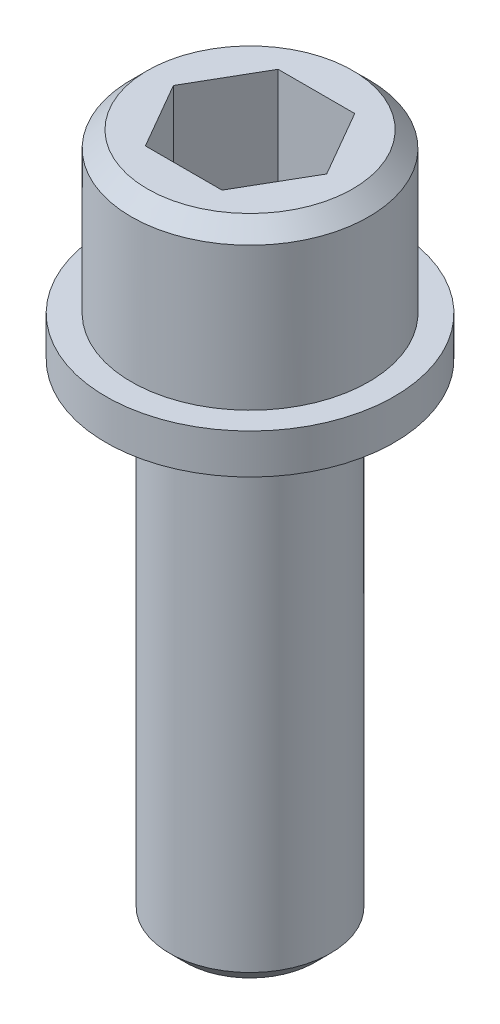
ISO-10303-21;
HEADER;
FILE_DESCRIPTION(('STEP AP214'),'2;1');
FILE_NAME('part.step','',(''),(''),'','','');
FILE_SCHEMA(('AUTOMOTIVE_DESIGN { 1 0 10303 214 1 1 1 1 }'));
ENDSEC;
DATA;
#1=APPLICATION_CONTEXT('core data for automotive mechanical design processes');
#2=APPLICATION_PROTOCOL_DEFINITION('international standard','automotive_design',2000,#1);
#3=PRODUCT_CONTEXT('',#1,'mechanical');
#4=PRODUCT('Part','Part','',(#3));
#5=PRODUCT_RELATED_PRODUCT_CATEGORY('part','',(#4));
#6=PRODUCT_DEFINITION_FORMATION('','',#4);
#7=PRODUCT_DEFINITION_CONTEXT('part definition',#1,'design');
#8=PRODUCT_DEFINITION('design','',#6,#7);
#9=PRODUCT_DEFINITION_SHAPE('','',#8);
#10=(LENGTH_UNIT() NAMED_UNIT(*) SI_UNIT(.MILLI.,.METRE.));
#11=(NAMED_UNIT(*) PLANE_ANGLE_UNIT() SI_UNIT($,.RADIAN.));
#12=(NAMED_UNIT(*) SI_UNIT($,.STERADIAN.) SOLID_ANGLE_UNIT());
#13=UNCERTAINTY_MEASURE_WITH_UNIT(LENGTH_MEASURE(1.E-05),#10,'distance_accuracy_value','');
#14=(GEOMETRIC_REPRESENTATION_CONTEXT(3) GLOBAL_UNCERTAINTY_ASSIGNED_CONTEXT((#13)) GLOBAL_UNIT_ASSIGNED_CONTEXT((#10,
#11,#12)) REPRESENTATION_CONTEXT('',''));
#15=CARTESIAN_POINT('',(0.,0.,0.));
#16=DIRECTION('',(0.,0.,1.));
#17=DIRECTION('',(1.,0.,0.));
#18=AXIS2_PLACEMENT_3D('',#15,#16,#17);
#19=CARTESIAN_POINT('',(0.,41.275,0.));
#20=DIRECTION('',(0.,1.,0.));
#21=DIRECTION('',(0.,0.,1.));
#22=AXIS2_PLACEMENT_3D('',#19,#20,#21);
#23=PLANE('',#22);
#24=CARTESIAN_POINT('',(0.,41.275,0.));
#25=DIRECTION('',(0.,1.,0.));
#26=DIRECTION('',(0.,0.,1.));
#27=AXIS2_PLACEMENT_3D('',#24,#25,#26);
#28=CIRCLE('',#27,6.1468);
#29=CARTESIAN_POINT('',(0.,41.275,6.1468));
#30=VERTEX_POINT('',#29);
#31=EDGE_CURVE('E11',#30,#30,#28,.T.);
#32=ORIENTED_EDGE('',*,*,#31,.T.);
#33=EDGE_LOOP('',(#32));
#34=FACE_BOUND('',#33,.T.);
#35=DIRECTION('',(-1.,0.,0.));
#36=VECTOR('',#35,1.);
#37=CARTESIAN_POINT('',(2.29502505505568,41.275,-3.9751));
#38=LINE('',#37,#36);
#39=CARTESIAN_POINT('',(2.29502505505568,41.275,-3.9751));
#40=VERTEX_POINT('',#39);
#41=CARTESIAN_POINT('',(-2.29502505505568,41.275,-3.9751));
#42=VERTEX_POINT('',#41);
#43=EDGE_CURVE('E49',#40,#42,#38,.T.);
#44=ORIENTED_EDGE('',*,*,#43,.F.);
#45=DIRECTION('',(-0.5,0.,-0.866025403784439));
#46=VECTOR('',#45,1.);
#47=CARTESIAN_POINT('',(4.59005011011136,41.275,0.));
#48=LINE('',#47,#46);
#49=CARTESIAN_POINT('',(4.59005011011136,41.275,0.));
#50=VERTEX_POINT('',#49);
#51=EDGE_CURVE('E132',#50,#40,#48,.T.);
#52=ORIENTED_EDGE('',*,*,#51,.F.);
#53=DIRECTION('',(0.5,0.,-0.866025403784439));
#54=VECTOR('',#53,1.);
#55=CARTESIAN_POINT('',(2.29502505505568,41.275,3.9751));
#56=LINE('',#55,#54);
#57=CARTESIAN_POINT('',(2.29502505505568,41.275,3.9751));
#58=VERTEX_POINT('',#57);
#59=EDGE_CURVE('E130',#58,#50,#56,.T.);
#60=ORIENTED_EDGE('',*,*,#59,.F.);
#61=DIRECTION('',(1.,0.,0.));
#62=VECTOR('',#61,1.);
#63=CARTESIAN_POINT('',(-2.29502505505568,41.275,3.9751));
#64=LINE('',#63,#62);
#65=CARTESIAN_POINT('',(-2.29502505505568,41.275,3.9751));
#66=VERTEX_POINT('',#65);
#67=EDGE_CURVE('E97',#66,#58,#64,.T.);
#68=ORIENTED_EDGE('',*,*,#67,.F.);
#69=DIRECTION('',(0.5,0.,0.866025403784438));
#70=VECTOR('',#69,1.);
#71=CARTESIAN_POINT('',(-4.59005011011136,41.275,0.));
#72=LINE('',#71,#70);
#73=CARTESIAN_POINT('',(-4.59005011011136,41.275,0.));
#74=VERTEX_POINT('',#73);
#75=EDGE_CURVE('E126',#74,#66,#72,.T.);
#76=ORIENTED_EDGE('',*,*,#75,.F.);
#77=DIRECTION('',(-0.5,0.,0.866025403784439));
#78=VECTOR('',#77,1.);
#79=CARTESIAN_POINT('',(-2.29502505505568,41.275,-3.9751));
#80=LINE('',#79,#78);
#81=EDGE_CURVE('E123',#42,#74,#80,.T.);
#82=ORIENTED_EDGE('',*,*,#81,.F.);
#83=EDGE_LOOP('',(#44,#52,#60,#68,#76,#82));
#84=FACE_BOUND('',#83,.T.);
#85=ADVANCED_FACE('F34',(#34,#84),#23,.T.);
#86=CARTESIAN_POINT('',(0.,0.,0.));
#87=DIRECTION('',(0.,-1.,0.));
#88=DIRECTION('',(0.,0.,-1.));
#89=AXIS2_PLACEMENT_3D('',#86,#87,#88);
#90=CYLINDRICAL_SURFACE('',#89,7.112);
#91=CARTESIAN_POINT('',(0.,40.3098,0.));
#92=DIRECTION('',(0.,1.,0.));
#93=DIRECTION('',(0.,0.,1.));
#94=AXIS2_PLACEMENT_3D('',#91,#92,#93);
#95=CIRCLE('',#94,7.112);
#96=CARTESIAN_POINT('',(0.,40.3098,7.112));
#97=VERTEX_POINT('',#96);
#98=EDGE_CURVE('E42',#97,#97,#95,.F.);
#99=ORIENTED_EDGE('',*,*,#98,.T.);
#100=EDGE_LOOP('',(#99));
#101=FACE_BOUND('',#100,.T.);
#102=CARTESIAN_POINT('',(0.,31.75,0.));
#103=DIRECTION('',(0.,-1.,0.));
#104=DIRECTION('',(0.,0.,-1.));
#105=AXIS2_PLACEMENT_3D('',#102,#103,#104);
#106=CIRCLE('',#105,7.112);
#107=CARTESIAN_POINT('',(0.,31.75,-7.112));
#108=VERTEX_POINT('',#107);
#109=EDGE_CURVE('E150',#108,#108,#106,.T.);
#110=ORIENTED_EDGE('',*,*,#109,.F.);
#111=EDGE_LOOP('',(#110));
#112=FACE_BOUND('',#111,.T.);
#113=ADVANCED_FACE('F161',(#101,#112),#90,.T.);
#114=CARTESIAN_POINT('',(7.112,31.75,0.));
#115=DIRECTION('',(0.,1.,0.));
#116=DIRECTION('',(0.,0.,1.));
#117=AXIS2_PLACEMENT_3D('',#114,#115,#116);
#118=PLANE('',#117);
#119=ORIENTED_EDGE('',*,*,#109,.T.);
#120=EDGE_LOOP('',(#119));
#121=FACE_BOUND('',#120,.T.);
#122=CARTESIAN_POINT('',(0.,31.75,0.));
#123=DIRECTION('',(0.,-1.,0.));
#124=DIRECTION('',(0.,0.,-1.));
#125=AXIS2_PLACEMENT_3D('',#122,#123,#124);
#126=CIRCLE('',#125,8.636);
#127=CARTESIAN_POINT('',(0.,31.75,-8.636));
#128=VERTEX_POINT('',#127);
#129=EDGE_CURVE('E147',#128,#128,#126,.T.);
#130=ORIENTED_EDGE('',*,*,#129,.F.);
#131=EDGE_LOOP('',(#130));
#132=FACE_BOUND('',#131,.T.);
#133=ADVANCED_FACE('F178',(#121,#132),#118,.T.);
#134=CARTESIAN_POINT('',(0.,0.,0.));
#135=DIRECTION('',(0.,-1.,0.));
#136=DIRECTION('',(0.,0.,-1.));
#137=AXIS2_PLACEMENT_3D('',#134,#135,#136);
#138=CYLINDRICAL_SURFACE('',#137,8.636);
#139=ORIENTED_EDGE('',*,*,#129,.T.);
#140=EDGE_LOOP('',(#139));
#141=FACE_BOUND('',#140,.T.);
#142=CARTESIAN_POINT('',(0.,29.3624,0.));
#143=DIRECTION('',(0.,-1.,0.));
#144=DIRECTION('',(0.,0.,-1.));
#145=AXIS2_PLACEMENT_3D('',#142,#143,#144);
#146=CIRCLE('',#145,8.636);
#147=CARTESIAN_POINT('',(0.,29.3624,-8.636));
#148=VERTEX_POINT('',#147);
#149=EDGE_CURVE('E144',#148,#148,#146,.T.);
#150=ORIENTED_EDGE('',*,*,#149,.F.);
#151=EDGE_LOOP('',(#150));
#152=FACE_BOUND('',#151,.T.);
#153=ADVANCED_FACE('F184',(#141,#152),#138,.T.);
#154=CARTESIAN_POINT('',(8.636,29.3624,0.));
#155=DIRECTION('',(0.,-1.,0.));
#156=DIRECTION('',(0.,0.,-1.));
#157=AXIS2_PLACEMENT_3D('',#154,#155,#156);
#158=PLANE('',#157);
#159=ORIENTED_EDGE('',*,*,#149,.T.);
#160=EDGE_LOOP('',(#159));
#161=FACE_BOUND('',#160,.T.);
#162=CARTESIAN_POINT('',(0.,29.3624,0.));
#163=DIRECTION('',(0.,-1.,0.));
#164=DIRECTION('',(0.,0.,-1.));
#165=AXIS2_PLACEMENT_3D('',#162,#163,#164);
#166=CIRCLE('',#165,4.826);
#167=CARTESIAN_POINT('',(0.,29.3624,-4.826));
#168=VERTEX_POINT('',#167);
#169=EDGE_CURVE('E136',#168,#168,#166,.T.);
#170=ORIENTED_EDGE('',*,*,#169,.F.);
#171=EDGE_LOOP('',(#170));
#172=FACE_BOUND('',#171,.T.);
#173=ADVANCED_FACE('F188',(#161,#172),#158,.T.);
#174=CARTESIAN_POINT('',(0.,0.,0.));
#175=DIRECTION('',(0.,-1.,0.));
#176=DIRECTION('',(0.,0.,-1.));
#177=AXIS2_PLACEMENT_3D('',#174,#175,#176);
#178=CYLINDRICAL_SURFACE('',#177,4.826);
#179=CARTESIAN_POINT('',(0.,0.965200000000007,0.));
#180=DIRECTION('',(0.,-1.,0.));
#181=DIRECTION('',(0.,0.,-1.));
#182=AXIS2_PLACEMENT_3D('',#179,#180,#181);
#183=CIRCLE('',#182,4.826);
#184=CARTESIAN_POINT('',(0.,0.965200000000007,-4.826));
#185=VERTEX_POINT('',#184);
#186=EDGE_CURVE('E156',#185,#185,#183,.F.);
#187=ORIENTED_EDGE('',*,*,#186,.T.);
#188=EDGE_LOOP('',(#187));
#189=FACE_BOUND('',#188,.T.);
#190=ORIENTED_EDGE('',*,*,#169,.T.);
#191=EDGE_LOOP('',(#190));
#192=FACE_BOUND('',#191,.T.);
#193=ADVANCED_FACE('F192',(#189,#192),#178,.T.);
#194=CARTESIAN_POINT('',(4.826,0.,0.));
#195=DIRECTION('',(0.,-1.,0.));
#196=DIRECTION('',(0.,0.,-1.));
#197=AXIS2_PLACEMENT_3D('',#194,#195,#196);
#198=PLANE('',#197);
#199=CARTESIAN_POINT('',(0.,0.,0.));
#200=DIRECTION('',(0.,-1.,0.));
#201=DIRECTION('',(0.,0.,-1.));
#202=AXIS2_PLACEMENT_3D('',#199,#200,#201);
#203=CIRCLE('',#202,3.8608);
#204=CARTESIAN_POINT('',(0.,0.,-3.8608));
#205=VERTEX_POINT('',#204);
#206=EDGE_CURVE('E153',#205,#205,#203,.T.);
#207=ORIENTED_EDGE('',*,*,#206,.T.);
#208=EDGE_LOOP('',(#207));
#209=FACE_BOUND('',#208,.T.);
#210=ADVANCED_FACE('F196',(#209),#198,.T.);
#211=CARTESIAN_POINT('',(2.29502505505568,34.925,-3.9751));
#212=DIRECTION('',(0.,0.,-1.));
#213=DIRECTION('',(-1.,0.,0.));
#214=AXIS2_PLACEMENT_3D('',#211,#212,#213);
#215=PLANE('',#214);
#216=ORIENTED_EDGE('',*,*,#43,.T.);
#217=DIRECTION('',(0.,1.,0.));
#218=VECTOR('',#217,1.);
#219=CARTESIAN_POINT('',(-2.29502505505568,34.925,-3.9751));
#220=LINE('',#219,#218);
#221=CARTESIAN_POINT('',(-2.29502505505568,34.925,-3.9751));
#222=VERTEX_POINT('',#221);
#223=EDGE_CURVE('E79',#222,#42,#220,.T.);
#224=ORIENTED_EDGE('',*,*,#223,.F.);
#225=DIRECTION('',(-1.,0.,0.));
#226=VECTOR('',#225,1.);
#227=CARTESIAN_POINT('',(2.29502505505568,34.925,-3.9751));
#228=LINE('',#227,#226);
#229=CARTESIAN_POINT('',(2.29502505505568,34.925,-3.9751));
#230=VERTEX_POINT('',#229);
#231=EDGE_CURVE('E134',#230,#222,#228,.T.);
#232=ORIENTED_EDGE('',*,*,#231,.F.);
#233=DIRECTION('',(0.,1.,0.));
#234=VECTOR('',#233,1.);
#235=CARTESIAN_POINT('',(2.29502505505568,34.925,-3.9751));
#236=LINE('',#235,#234);
#237=EDGE_CURVE('E57',#230,#40,#236,.T.);
#238=ORIENTED_EDGE('',*,*,#237,.T.);
#239=EDGE_LOOP('',(#216,#224,#232,#238));
#240=FACE_BOUND('',#239,.T.);
#241=ADVANCED_FACE('F200',(#240),#215,.F.);
#242=CARTESIAN_POINT('',(4.59005011011136,34.925,0.));
#243=DIRECTION('',(0.866025403784439,0.,-0.5));
#244=DIRECTION('',(-0.5,0.,-0.866025403784439));
#245=AXIS2_PLACEMENT_3D('',#242,#243,#244);
#246=PLANE('',#245);
#247=ORIENTED_EDGE('',*,*,#51,.T.);
#248=ORIENTED_EDGE('',*,*,#237,.F.);
#249=DIRECTION('',(-0.5,0.,-0.866025403784439));
#250=VECTOR('',#249,1.);
#251=CARTESIAN_POINT('',(4.59005011011136,34.925,0.));
#252=LINE('',#251,#250);
#253=CARTESIAN_POINT('',(4.59005011011136,34.925,0.));
#254=VERTEX_POINT('',#253);
#255=EDGE_CURVE('E109',#254,#230,#252,.T.);
#256=ORIENTED_EDGE('',*,*,#255,.F.);
#257=DIRECTION('',(0.,1.,0.));
#258=VECTOR('',#257,1.);
#259=CARTESIAN_POINT('',(4.59005011011136,34.925,0.));
#260=LINE('',#259,#258);
#261=EDGE_CURVE('E101',#254,#50,#260,.T.);
#262=ORIENTED_EDGE('',*,*,#261,.T.);
#263=EDGE_LOOP('',(#247,#248,#256,#262));
#264=FACE_BOUND('',#263,.T.);
#265=ADVANCED_FACE('F204',(#264),#246,.F.);
#266=CARTESIAN_POINT('',(2.29502505505568,34.925,3.9751));
#267=DIRECTION('',(0.866025403784439,0.,0.5));
#268=DIRECTION('',(0.5,0.,-0.866025403784439));
#269=AXIS2_PLACEMENT_3D('',#266,#267,#268);
#270=PLANE('',#269);
#271=ORIENTED_EDGE('',*,*,#59,.T.);
#272=ORIENTED_EDGE('',*,*,#261,.F.);
#273=DIRECTION('',(0.5,0.,-0.866025403784439));
#274=VECTOR('',#273,1.);
#275=CARTESIAN_POINT('',(2.29502505505568,34.925,3.9751));
#276=LINE('',#275,#274);
#277=CARTESIAN_POINT('',(2.29502505505568,34.925,3.9751));
#278=VERTEX_POINT('',#277);
#279=EDGE_CURVE('E105',#278,#254,#276,.T.);
#280=ORIENTED_EDGE('',*,*,#279,.F.);
#281=DIRECTION('',(0.,1.,0.));
#282=VECTOR('',#281,1.);
#283=CARTESIAN_POINT('',(2.29502505505568,34.925,3.9751));
#284=LINE('',#283,#282);
#285=EDGE_CURVE('E90',#278,#58,#284,.T.);
#286=ORIENTED_EDGE('',*,*,#285,.T.);
#287=EDGE_LOOP('',(#271,#272,#280,#286));
#288=FACE_BOUND('',#287,.T.);
#289=ADVANCED_FACE('F106',(#288),#270,.F.);
#290=CARTESIAN_POINT('',(-2.29502505505568,34.925,3.9751));
#291=DIRECTION('',(0.,0.,1.));
#292=DIRECTION('',(1.,0.,0.));
#293=AXIS2_PLACEMENT_3D('',#290,#291,#292);
#294=PLANE('',#293);
#295=ORIENTED_EDGE('',*,*,#67,.T.);
#296=ORIENTED_EDGE('',*,*,#285,.F.);
#297=DIRECTION('',(1.,0.,0.));
#298=VECTOR('',#297,1.);
#299=CARTESIAN_POINT('',(-2.29502505505568,34.925,3.9751));
#300=LINE('',#299,#298);
#301=CARTESIAN_POINT('',(-2.29502505505568,34.925,3.9751));
#302=VERTEX_POINT('',#301);
#303=EDGE_CURVE('E94',#302,#278,#300,.T.);
#304=ORIENTED_EDGE('',*,*,#303,.F.);
#305=DIRECTION('',(0.,1.,0.));
#306=VECTOR('',#305,1.);
#307=CARTESIAN_POINT('',(-2.29502505505568,34.925,3.9751));
#308=LINE('',#307,#306);
#309=EDGE_CURVE('E102',#302,#66,#308,.T.);
#310=ORIENTED_EDGE('',*,*,#309,.T.);
#311=EDGE_LOOP('',(#295,#296,#304,#310));
#312=FACE_BOUND('',#311,.T.);
#313=ADVANCED_FACE('F92',(#312),#294,.F.);
#314=CARTESIAN_POINT('',(-4.59005011011136,34.925,0.));
#315=DIRECTION('',(-0.866025403784438,0.,0.5));
#316=DIRECTION('',(0.5,0.,0.866025403784438));
#317=AXIS2_PLACEMENT_3D('',#314,#315,#316);
#318=PLANE('',#317);
#319=ORIENTED_EDGE('',*,*,#75,.T.);
#320=ORIENTED_EDGE('',*,*,#309,.F.);
#321=DIRECTION('',(0.5,0.,0.866025403784438));
#322=VECTOR('',#321,1.);
#323=CARTESIAN_POINT('',(-4.59005011011136,34.925,0.));
#324=LINE('',#323,#322);
#325=CARTESIAN_POINT('',(-4.59005011011136,34.925,0.));
#326=VERTEX_POINT('',#325);
#327=EDGE_CURVE('E115',#326,#302,#324,.T.);
#328=ORIENTED_EDGE('',*,*,#327,.F.);
#329=DIRECTION('',(0.,1.,0.));
#330=VECTOR('',#329,1.);
#331=CARTESIAN_POINT('',(-4.59005011011136,34.925,0.));
#332=LINE('',#331,#330);
#333=EDGE_CURVE('E139',#326,#74,#332,.T.);
#334=ORIENTED_EDGE('',*,*,#333,.T.);
#335=EDGE_LOOP('',(#319,#320,#328,#334));
#336=FACE_BOUND('',#335,.T.);
#337=ADVANCED_FACE('F208',(#336),#318,.F.);
#338=CARTESIAN_POINT('',(-2.29502505505568,34.925,-3.9751));
#339=DIRECTION('',(-0.866025403784439,0.,-0.5));
#340=DIRECTION('',(-0.5,0.,0.866025403784439));
#341=AXIS2_PLACEMENT_3D('',#338,#339,#340);
#342=PLANE('',#341);
#343=ORIENTED_EDGE('',*,*,#81,.T.);
#344=ORIENTED_EDGE('',*,*,#333,.F.);
#345=DIRECTION('',(-0.5,0.,0.866025403784439));
#346=VECTOR('',#345,1.);
#347=CARTESIAN_POINT('',(-2.29502505505568,34.925,-3.9751));
#348=LINE('',#347,#346);
#349=EDGE_CURVE('E117',#222,#326,#348,.T.);
#350=ORIENTED_EDGE('',*,*,#349,.F.);
#351=ORIENTED_EDGE('',*,*,#223,.T.);
#352=EDGE_LOOP('',(#343,#344,#350,#351));
#353=FACE_BOUND('',#352,.T.);
#354=ADVANCED_FACE('F205',(#353),#342,.F.);
#355=CARTESIAN_POINT('',(0.,34.925,0.));
#356=DIRECTION('',(0.,1.,0.));
#357=DIRECTION('',(0.,0.,1.));
#358=AXIS2_PLACEMENT_3D('',#355,#356,#357);
#359=PLANE('',#358);
#360=ORIENTED_EDGE('',*,*,#231,.T.);
#361=ORIENTED_EDGE('',*,*,#349,.T.);
#362=ORIENTED_EDGE('',*,*,#327,.T.);
#363=ORIENTED_EDGE('',*,*,#303,.T.);
#364=ORIENTED_EDGE('',*,*,#279,.T.);
#365=ORIENTED_EDGE('',*,*,#255,.T.);
#366=EDGE_LOOP('',(#360,#361,#362,#363,#364,#365));
#367=FACE_BOUND('',#366,.T.);
#368=ADVANCED_FACE('F112',(#367),#359,.T.);
#369=CARTESIAN_POINT('',(0.,0.,0.));
#370=DIRECTION('',(0.,1.,0.));
#371=DIRECTION('',(0.,0.,1.));
#372=AXIS2_PLACEMENT_3D('',#369,#370,#371);
#373=CONICAL_SURFACE('',#372,3.8608,0.785398163397446);
#374=ORIENTED_EDGE('',*,*,#186,.F.);
#375=EDGE_LOOP('',(#374));
#376=FACE_BOUND('',#375,.T.);
#377=ORIENTED_EDGE('',*,*,#206,.F.);
#378=EDGE_LOOP('',(#377));
#379=FACE_BOUND('',#378,.T.);
#380=ADVANCED_FACE('F165',(#376,#379),#373,.T.);
#381=CARTESIAN_POINT('',(0.,40.3098,0.));
#382=DIRECTION('',(0.,-1.,0.));
#383=DIRECTION('',(0.,0.,-1.));
#384=AXIS2_PLACEMENT_3D('',#381,#382,#383);
#385=CONICAL_SURFACE('',#384,7.112,0.78539816339745);
#386=ORIENTED_EDGE('',*,*,#31,.F.);
#387=EDGE_LOOP('',(#386));
#388=FACE_BOUND('',#387,.T.);
#389=ORIENTED_EDGE('',*,*,#98,.F.);
#390=EDGE_LOOP('',(#389));
#391=FACE_BOUND('',#390,.T.);
#392=ADVANCED_FACE('F36',(#388,#391),#385,.T.);
#393=CLOSED_SHELL('',(#85,#113,#133,#153,#173,#193,#210,#241,#265,#289,#313,#337,#354,#368,#380,#392));
#394=MANIFOLD_SOLID_BREP('B2',#393);
#395=ADVANCED_BREP_SHAPE_REPRESENTATION('',(#18,#394),#14);
#396=SHAPE_DEFINITION_REPRESENTATION(#9,#395);
ENDSEC;
END-ISO-10303-21;
